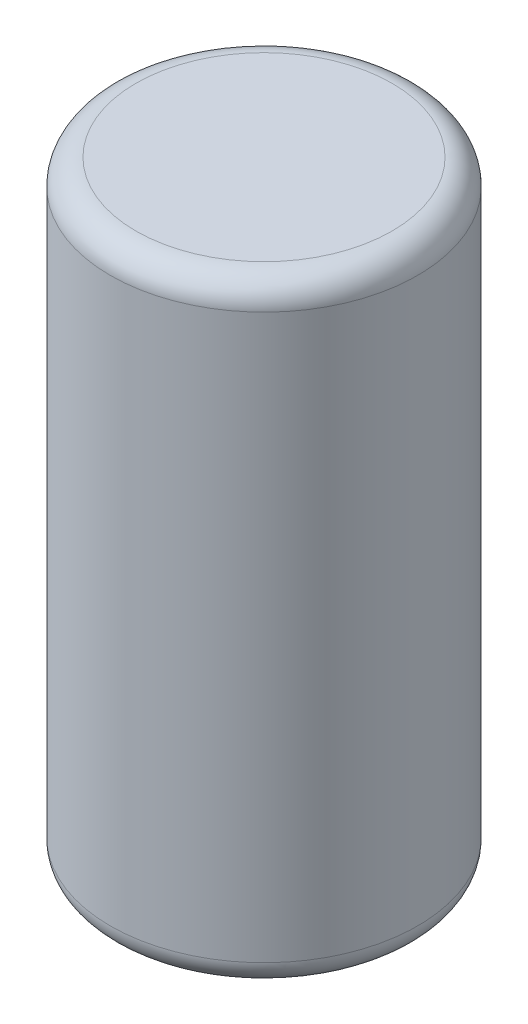
ISO-10303-21;
HEADER;
FILE_DESCRIPTION(('STEP AP214'),'2;1');
FILE_NAME('part.step','',(''),(''),'','','');
FILE_SCHEMA(('AUTOMOTIVE_DESIGN { 1 0 10303 214 1 1 1 1 }'));
ENDSEC;
DATA;
#1=APPLICATION_CONTEXT('core data for automotive mechanical design processes');
#2=APPLICATION_PROTOCOL_DEFINITION('international standard','automotive_design',2000,#1);
#3=PRODUCT_CONTEXT('',#1,'mechanical');
#4=PRODUCT('Part','Part','',(#3));
#5=PRODUCT_RELATED_PRODUCT_CATEGORY('part','',(#4));
#6=PRODUCT_DEFINITION_FORMATION('','',#4);
#7=PRODUCT_DEFINITION_CONTEXT('part definition',#1,'design');
#8=PRODUCT_DEFINITION('design','',#6,#7);
#9=PRODUCT_DEFINITION_SHAPE('','',#8);
#10=(LENGTH_UNIT() NAMED_UNIT(*) SI_UNIT(.MILLI.,.METRE.));
#11=(NAMED_UNIT(*) PLANE_ANGLE_UNIT() SI_UNIT($,.RADIAN.));
#12=(NAMED_UNIT(*) SI_UNIT($,.STERADIAN.) SOLID_ANGLE_UNIT());
#13=UNCERTAINTY_MEASURE_WITH_UNIT(LENGTH_MEASURE(1.E-05),#10,'distance_accuracy_value','');
#14=(GEOMETRIC_REPRESENTATION_CONTEXT(3) GLOBAL_UNCERTAINTY_ASSIGNED_CONTEXT((#13)) GLOBAL_UNIT_ASSIGNED_CONTEXT((#10,
#11,#12)) REPRESENTATION_CONTEXT('',''));
#15=CARTESIAN_POINT('',(0.,0.,0.));
#16=DIRECTION('',(0.,0.,1.));
#17=DIRECTION('',(1.,0.,0.));
#18=AXIS2_PLACEMENT_3D('',#15,#16,#17);
#19=CARTESIAN_POINT('',(2.5,6.,0.));
#20=DIRECTION('',(0.,-1.,0.));
#21=DIRECTION('',(0.,0.,-1.));
#22=AXIS2_PLACEMENT_3D('',#19,#20,#21);
#23=PLANE('',#22);
#24=CARTESIAN_POINT('',(0.,6.,0.));
#25=DIRECTION('',(0.,1.,0.));
#26=DIRECTION('',(0.,0.,1.));
#27=AXIS2_PLACEMENT_3D('',#24,#25,#26);
#28=CIRCLE('',#27,2.5);
#29=CARTESIAN_POINT('',(0.,6.,2.5));
#30=VERTEX_POINT('',#29);
#31=EDGE_CURVE('E49',#30,#30,#28,.T.);
#32=ORIENTED_EDGE('',*,*,#31,.T.);
#33=EDGE_LOOP('',(#32));
#34=FACE_BOUND('',#33,.T.);
#35=ADVANCED_FACE('F35',(#34),#23,.F.);
#36=CARTESIAN_POINT('',(0.,-6.,0.));
#37=DIRECTION('',(0.,1.,0.));
#38=DIRECTION('',(0.,0.,1.));
#39=AXIS2_PLACEMENT_3D('',#36,#37,#38);
#40=PLANE('',#39);
#41=CARTESIAN_POINT('',(0.,-6.,0.));
#42=DIRECTION('',(0.,1.,0.));
#43=DIRECTION('',(0.,0.,1.));
#44=AXIS2_PLACEMENT_3D('',#41,#42,#43);
#45=CIRCLE('',#44,2.5);
#46=CARTESIAN_POINT('',(0.,-6.,2.5));
#47=VERTEX_POINT('',#46);
#48=EDGE_CURVE('E10',#47,#47,#45,.T.);
#49=ORIENTED_EDGE('',*,*,#48,.F.);
#50=EDGE_LOOP('',(#49));
#51=FACE_BOUND('',#50,.T.);
#52=ADVANCED_FACE('F69',(#51),#40,.F.);
#53=CARTESIAN_POINT('',(0.,-5.5,0.));
#54=DIRECTION('',(0.,1.,0.));
#55=DIRECTION('',(0.,0.,1.));
#56=AXIS2_PLACEMENT_3D('',#53,#54,#55);
#57=TOROIDAL_SURFACE('',#56,2.5,0.5);
#58=CARTESIAN_POINT('',(0.,-5.5,0.));
#59=DIRECTION('',(0.,1.,0.));
#60=DIRECTION('',(0.,0.,1.));
#61=AXIS2_PLACEMENT_3D('',#58,#59,#60);
#62=CIRCLE('',#61,3.);
#63=CARTESIAN_POINT('',(0.,-5.5,3.));
#64=VERTEX_POINT('',#63);
#65=EDGE_CURVE('E41',#64,#64,#62,.T.);
#66=ORIENTED_EDGE('',*,*,#65,.F.);
#67=EDGE_LOOP('',(#66));
#68=FACE_BOUND('',#67,.T.);
#69=ORIENTED_EDGE('',*,*,#48,.T.);
#70=EDGE_LOOP('',(#69));
#71=FACE_BOUND('',#70,.T.);
#72=ADVANCED_FACE('F64',(#68,#71),#57,.T.);
#73=CARTESIAN_POINT('',(0.,6.,0.));
#74=DIRECTION('',(0.,1.,0.));
#75=DIRECTION('',(0.,0.,1.));
#76=AXIS2_PLACEMENT_3D('',#73,#74,#75);
#77=CYLINDRICAL_SURFACE('',#76,3.);
#78=CARTESIAN_POINT('',(0.,5.5,0.));
#79=DIRECTION('',(0.,1.,0.));
#80=DIRECTION('',(0.,0.,1.));
#81=AXIS2_PLACEMENT_3D('',#78,#79,#80);
#82=CIRCLE('',#81,3.);
#83=CARTESIAN_POINT('',(0.,5.5,3.));
#84=VERTEX_POINT('',#83);
#85=EDGE_CURVE('E45',#84,#84,#82,.T.);
#86=ORIENTED_EDGE('',*,*,#85,.F.);
#87=EDGE_LOOP('',(#86));
#88=FACE_BOUND('',#87,.T.);
#89=ORIENTED_EDGE('',*,*,#65,.T.);
#90=EDGE_LOOP('',(#89));
#91=FACE_BOUND('',#90,.T.);
#92=ADVANCED_FACE('F59',(#88,#91),#77,.T.);
#93=CARTESIAN_POINT('',(0.,5.5,0.));
#94=DIRECTION('',(0.,1.,0.));
#95=DIRECTION('',(0.,0.,1.));
#96=AXIS2_PLACEMENT_3D('',#93,#94,#95);
#97=TOROIDAL_SURFACE('',#96,2.5,0.5);
#98=ORIENTED_EDGE('',*,*,#31,.F.);
#99=EDGE_LOOP('',(#98));
#100=FACE_BOUND('',#99,.T.);
#101=ORIENTED_EDGE('',*,*,#85,.T.);
#102=EDGE_LOOP('',(#101));
#103=FACE_BOUND('',#102,.T.);
#104=ADVANCED_FACE('F56',(#100,#103),#97,.T.);
#105=CLOSED_SHELL('',(#35,#52,#72,#92,#104));
#106=MANIFOLD_SOLID_BREP('B2',#105);
#107=ADVANCED_BREP_SHAPE_REPRESENTATION('',(#18,#106),#14);
#108=SHAPE_DEFINITION_REPRESENTATION(#9,#107);
ENDSEC;
END-ISO-10303-21;
